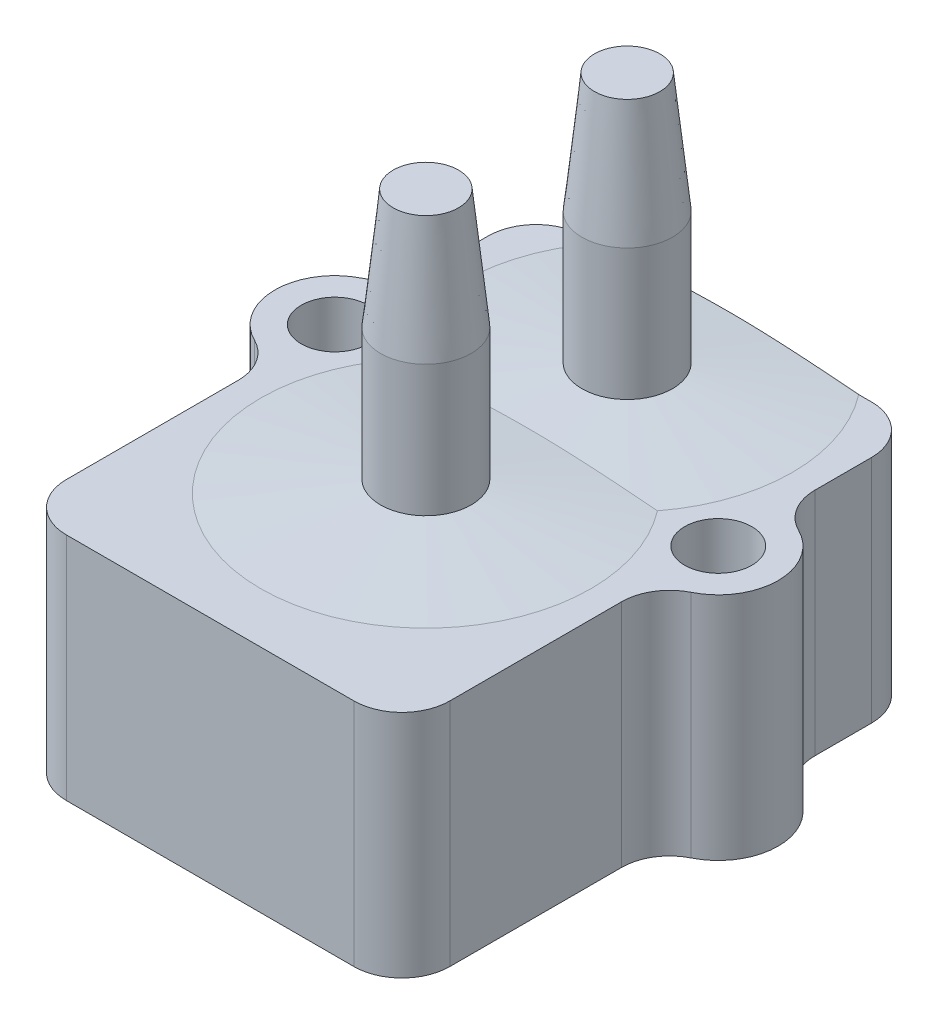
ISO-10303-21;
HEADER;
FILE_DESCRIPTION(('STEP AP214'),'2;1');
FILE_NAME('part.step','',(''),(''),'','','');
FILE_SCHEMA(('AUTOMOTIVE_DESIGN { 1 0 10303 214 1 1 1 1 }'));
ENDSEC;
DATA;
#1=APPLICATION_CONTEXT('core data for automotive mechanical design processes');
#2=APPLICATION_PROTOCOL_DEFINITION('international standard','automotive_design',2000,#1);
#3=PRODUCT_CONTEXT('',#1,'mechanical');
#4=PRODUCT('Part','Part','',(#3));
#5=PRODUCT_RELATED_PRODUCT_CATEGORY('part','',(#4));
#6=PRODUCT_DEFINITION_FORMATION('','',#4);
#7=PRODUCT_DEFINITION_CONTEXT('part definition',#1,'design');
#8=PRODUCT_DEFINITION('design','',#6,#7);
#9=PRODUCT_DEFINITION_SHAPE('','',#8);
#10=(LENGTH_UNIT() NAMED_UNIT(*) SI_UNIT(.MILLI.,.METRE.));
#11=(NAMED_UNIT(*) PLANE_ANGLE_UNIT() SI_UNIT($,.RADIAN.));
#12=(NAMED_UNIT(*) SI_UNIT($,.STERADIAN.) SOLID_ANGLE_UNIT());
#13=UNCERTAINTY_MEASURE_WITH_UNIT(LENGTH_MEASURE(1.E-05),#10,'distance_accuracy_value','');
#14=(GEOMETRIC_REPRESENTATION_CONTEXT(3) GLOBAL_UNCERTAINTY_ASSIGNED_CONTEXT((#13)) GLOBAL_UNIT_ASSIGNED_CONTEXT((#10,
#11,#12)) REPRESENTATION_CONTEXT('',''));
#15=CARTESIAN_POINT('',(0.,0.,0.));
#16=DIRECTION('',(0.,0.,1.));
#17=DIRECTION('',(1.,0.,0.));
#18=AXIS2_PLACEMENT_3D('',#15,#16,#17);
#19=CARTESIAN_POINT('',(-10.16,6.096,-3.048));
#20=DIRECTION('',(0.,1.,0.));
#21=DIRECTION('',(0.,0.,1.));
#22=AXIS2_PLACEMENT_3D('',#19,#20,#21);
#23=PLANE('',#22);
#24=CARTESIAN_POINT('',(-10.16,6.096,-3.048));
#25=DIRECTION('',(0.,1.,0.));
#26=DIRECTION('',(0.,0.,1.));
#27=AXIS2_PLACEMENT_3D('',#24,#25,#26);
#28=CIRCLE('',#27,1.778);
#29=CARTESIAN_POINT('',(-10.16,6.096,-4.826));
#30=VERTEX_POINT('',#29);
#31=EDGE_CURVE('E395',#30,#30,#28,.T.);
#32=ORIENTED_EDGE('',*,*,#31,.F.);
#33=EDGE_LOOP('',(#32));
#34=FACE_BOUND('',#33,.T.);
#35=CARTESIAN_POINT('',(0.,6.096,2.28599999999999));
#36=DIRECTION('',(0.,1.,0.));
#37=DIRECTION('',(0.,0.,1.));
#38=AXIS2_PLACEMENT_3D('',#35,#36,#37);
#39=CIRCLE('',#38,8.75030000000001);
#40=CARTESIAN_POINT('',(6.93658374778251,6.096,-3.048));
#41=VERTEX_POINT('',#40);
#42=CARTESIAN_POINT('',(-6.93658374778248,6.096,-3.048));
#43=VERTEX_POINT('',#42);
#44=EDGE_CURVE('E281',#41,#43,#39,.F.);
#45=ORIENTED_EDGE('',*,*,#44,.T.);
#46=CARTESIAN_POINT('',(0.,6.096,-8.382));
#47=DIRECTION('',(0.,1.,0.));
#48=DIRECTION('',(0.,0.,1.));
#49=AXIS2_PLACEMENT_3D('',#46,#47,#48);
#50=CIRCLE('',#49,8.75030000000002);
#51=CARTESIAN_POINT('',(-6.93658374778248,6.096,-13.716));
#52=VERTEX_POINT('',#51);
#53=EDGE_CURVE('E283',#43,#52,#50,.F.);
#54=ORIENTED_EDGE('',*,*,#53,.T.);
#55=DIRECTION('',(-1.,0.,0.));
#56=VECTOR('',#55,1.);
#57=CARTESIAN_POINT('',(-10.16,6.096,-13.716));
#58=LINE('',#57,#56);
#59=CARTESIAN_POINT('',(-7.61999999999999,6.096,-13.716));
#60=VERTEX_POINT('',#59);
#61=EDGE_CURVE('E376',#52,#60,#58,.T.);
#62=ORIENTED_EDGE('',*,*,#61,.T.);
#63=CARTESIAN_POINT('',(-7.61999999999999,6.096,-11.176));
#64=DIRECTION('',(0.,1.,0.));
#65=DIRECTION('',(0.,0.,1.));
#66=AXIS2_PLACEMENT_3D('',#63,#64,#65);
#67=CIRCLE('',#66,2.54);
#68=CARTESIAN_POINT('',(-10.16,6.096,-11.176));
#69=VERTEX_POINT('',#68);
#70=EDGE_CURVE('E241',#60,#69,#67,.T.);
#71=ORIENTED_EDGE('',*,*,#70,.T.);
#72=DIRECTION('',(0.,0.,1.));
#73=VECTOR('',#72,1.);
#74=CARTESIAN_POINT('',(-10.16,6.096,-6.223));
#75=LINE('',#74,#73);
#76=CARTESIAN_POINT('',(-10.16,6.096,-8.16753367016958));
#77=VERTEX_POINT('',#76);
#78=EDGE_CURVE('E375',#69,#77,#75,.T.);
#79=ORIENTED_EDGE('',*,*,#78,.T.);
#80=CARTESIAN_POINT('',(-12.7,6.096,-8.16753367016958));
#81=DIRECTION('',(0.,1.,0.));
#82=DIRECTION('',(0.,0.,1.));
#83=AXIS2_PLACEMENT_3D('',#80,#81,#82);
#84=CIRCLE('',#83,2.54);
#85=CARTESIAN_POINT('',(-11.5711111111111,6.096,-5.89218537231644));
#86=VERTEX_POINT('',#85);
#87=EDGE_CURVE('E174',#77,#86,#84,.F.);
#88=ORIENTED_EDGE('',*,*,#87,.T.);
#89=CARTESIAN_POINT('',(-10.16,6.096,-3.048));
#90=DIRECTION('',(0.,1.,0.));
#91=DIRECTION('',(0.,0.,1.));
#92=AXIS2_PLACEMENT_3D('',#89,#90,#91);
#93=CIRCLE('',#92,3.175);
#94=CARTESIAN_POINT('',(-11.5711111111111,6.096,-0.203814627683572));
#95=VERTEX_POINT('',#94);
#96=EDGE_CURVE('E184',#86,#95,#93,.T.);
#97=ORIENTED_EDGE('',*,*,#96,.T.);
#98=CARTESIAN_POINT('',(-12.7,6.096,2.07153367016957));
#99=DIRECTION('',(0.,1.,0.));
#100=DIRECTION('',(0.,0.,1.));
#101=AXIS2_PLACEMENT_3D('',#98,#99,#100);
#102=CIRCLE('',#101,2.54);
#103=CARTESIAN_POINT('',(-10.16,6.096,2.07153367016957));
#104=VERTEX_POINT('',#103);
#105=EDGE_CURVE('E264',#95,#104,#102,.F.);
#106=ORIENTED_EDGE('',*,*,#105,.T.);
#107=DIRECTION('',(0.,0.,1.));
#108=VECTOR('',#107,1.);
#109=CARTESIAN_POINT('',(-10.16,6.096,13.716));
#110=LINE('',#109,#108);
#111=CARTESIAN_POINT('',(-10.16,6.096,11.176));
#112=VERTEX_POINT('',#111);
#113=EDGE_CURVE('E379',#104,#112,#110,.T.);
#114=ORIENTED_EDGE('',*,*,#113,.T.);
#115=CARTESIAN_POINT('',(-7.61999999999999,6.096,11.176));
#116=DIRECTION('',(0.,1.,0.));
#117=DIRECTION('',(0.,0.,1.));
#118=AXIS2_PLACEMENT_3D('',#115,#116,#117);
#119=CIRCLE('',#118,2.54);
#120=CARTESIAN_POINT('',(-7.61999999999999,6.096,13.716));
#121=VERTEX_POINT('',#120);
#122=EDGE_CURVE('E235',#112,#121,#119,.T.);
#123=ORIENTED_EDGE('',*,*,#122,.T.);
#124=DIRECTION('',(1.,0.,0.));
#125=VECTOR('',#124,1.);
#126=CARTESIAN_POINT('',(-10.16,6.096,13.716));
#127=LINE('',#126,#125);
#128=CARTESIAN_POINT('',(7.62000000000002,6.096,13.716));
#129=VERTEX_POINT('',#128);
#130=EDGE_CURVE('E386',#121,#129,#127,.T.);
#131=ORIENTED_EDGE('',*,*,#130,.T.);
#132=CARTESIAN_POINT('',(7.62000000000002,6.096,11.176));
#133=DIRECTION('',(0.,1.,0.));
#134=DIRECTION('',(0.,0.,1.));
#135=AXIS2_PLACEMENT_3D('',#132,#133,#134);
#136=CIRCLE('',#135,2.54);
#137=CARTESIAN_POINT('',(10.16,6.096,11.176));
#138=VERTEX_POINT('',#137);
#139=EDGE_CURVE('E237',#129,#138,#136,.T.);
#140=ORIENTED_EDGE('',*,*,#139,.T.);
#141=DIRECTION('',(0.,0.,-1.));
#142=VECTOR('',#141,1.);
#143=CARTESIAN_POINT('',(10.16,6.096,13.716));
#144=LINE('',#143,#142);
#145=CARTESIAN_POINT('',(10.16,6.096,2.07153367016957));
#146=VERTEX_POINT('',#145);
#147=EDGE_CURVE('E389',#138,#146,#144,.T.);
#148=ORIENTED_EDGE('',*,*,#147,.T.);
#149=CARTESIAN_POINT('',(12.7,6.096,2.07153367016957));
#150=DIRECTION('',(0.,1.,0.));
#151=DIRECTION('',(0.,0.,1.));
#152=AXIS2_PLACEMENT_3D('',#149,#150,#151);
#153=CIRCLE('',#152,2.54);
#154=CARTESIAN_POINT('',(11.5711111111111,6.096,-0.203814627683572));
#155=VERTEX_POINT('',#154);
#156=EDGE_CURVE('E272',#146,#155,#153,.F.);
#157=ORIENTED_EDGE('',*,*,#156,.T.);
#158=CARTESIAN_POINT('',(10.16,6.096,-3.048));
#159=DIRECTION('',(0.,1.,0.));
#160=DIRECTION('',(0.,0.,-1.));
#161=AXIS2_PLACEMENT_3D('',#158,#159,#160);
#162=CIRCLE('',#161,3.175);
#163=CARTESIAN_POINT('',(11.5711111111111,6.096,-5.89218537231644));
#164=VERTEX_POINT('',#163);
#165=EDGE_CURVE('E211',#155,#164,#162,.T.);
#166=ORIENTED_EDGE('',*,*,#165,.T.);
#167=CARTESIAN_POINT('',(12.7,6.096,-8.16753367016958));
#168=DIRECTION('',(0.,1.,0.));
#169=DIRECTION('',(0.,0.,1.));
#170=AXIS2_PLACEMENT_3D('',#167,#168,#169);
#171=CIRCLE('',#170,2.54);
#172=CARTESIAN_POINT('',(10.16,6.096,-8.16753367016958));
#173=VERTEX_POINT('',#172);
#174=EDGE_CURVE('E268',#164,#173,#171,.F.);
#175=ORIENTED_EDGE('',*,*,#174,.T.);
#176=DIRECTION('',(0.,0.,-1.));
#177=VECTOR('',#176,1.);
#178=CARTESIAN_POINT('',(10.16,6.096,-6.223));
#179=LINE('',#178,#177);
#180=CARTESIAN_POINT('',(10.16,6.096,-11.176));
#181=VERTEX_POINT('',#180);
#182=EDGE_CURVE('E210',#173,#181,#179,.T.);
#183=ORIENTED_EDGE('',*,*,#182,.T.);
#184=CARTESIAN_POINT('',(7.62000000000001,6.096,-11.176));
#185=DIRECTION('',(0.,1.,0.));
#186=DIRECTION('',(0.,0.,1.));
#187=AXIS2_PLACEMENT_3D('',#184,#185,#186);
#188=CIRCLE('',#187,2.54);
#189=CARTESIAN_POINT('',(7.62000000000001,6.096,-13.716));
#190=VERTEX_POINT('',#189);
#191=EDGE_CURVE('E239',#181,#190,#188,.T.);
#192=ORIENTED_EDGE('',*,*,#191,.T.);
#193=CARTESIAN_POINT('',(6.93658374778251,6.096,-13.716));
#194=VERTEX_POINT('',#193);
#195=EDGE_CURVE('E377',#190,#194,#58,.T.);
#196=ORIENTED_EDGE('',*,*,#195,.T.);
#197=CARTESIAN_POINT('',(0.,6.096,-8.382));
#198=DIRECTION('',(0.,1.,0.));
#199=DIRECTION('',(0.,0.,1.));
#200=AXIS2_PLACEMENT_3D('',#197,#198,#199);
#201=CIRCLE('',#200,8.75030000000002);
#202=EDGE_CURVE('E60',#194,#41,#201,.F.);
#203=ORIENTED_EDGE('',*,*,#202,.T.);
#204=EDGE_LOOP('',(#45,#54,#62,#71,#79,#88,#97,#106,#114,#123,#131,#140,#148,#157,#166,#175,
#183,#192,#196,#203));
#205=FACE_BOUND('',#204,.T.);
#206=CARTESIAN_POINT('',(10.16,6.096,-3.048));
#207=DIRECTION('',(0.,1.,0.));
#208=DIRECTION('',(0.,0.,-1.));
#209=AXIS2_PLACEMENT_3D('',#206,#207,#208);
#210=CIRCLE('',#209,1.778);
#211=CARTESIAN_POINT('',(10.16,6.096,-4.826));
#212=VERTEX_POINT('',#211);
#213=EDGE_CURVE('E404',#212,#212,#210,.T.);
#214=ORIENTED_EDGE('',*,*,#213,.F.);
#215=EDGE_LOOP('',(#214));
#216=FACE_BOUND('',#215,.T.);
#217=ADVANCED_FACE('F33',(#34,#205,#216),#23,.T.);
#218=CARTESIAN_POINT('',(-10.16,-6.096,-3.048));
#219=DIRECTION('',(0.,1.,0.));
#220=DIRECTION('',(0.,0.,1.));
#221=AXIS2_PLACEMENT_3D('',#218,#219,#220);
#222=PLANE('',#221);
#223=CARTESIAN_POINT('',(-10.16,-6.096,-3.048));
#224=DIRECTION('',(0.,1.,0.));
#225=DIRECTION('',(0.,0.,1.));
#226=AXIS2_PLACEMENT_3D('',#223,#224,#225);
#227=CIRCLE('',#226,1.778);
#228=CARTESIAN_POINT('',(-10.16,-6.096,-4.826));
#229=VERTEX_POINT('',#228);
#230=EDGE_CURVE('E400',#229,#229,#227,.T.);
#231=ORIENTED_EDGE('',*,*,#230,.T.);
#232=EDGE_LOOP('',(#231));
#233=FACE_BOUND('',#232,.T.);
#234=DIRECTION('',(0.,0.,1.));
#235=VECTOR('',#234,1.);
#236=CARTESIAN_POINT('',(-10.16,-6.096,-6.223));
#237=LINE('',#236,#235);
#238=CARTESIAN_POINT('',(-10.16,-6.096,-11.176));
#239=VERTEX_POINT('',#238);
#240=CARTESIAN_POINT('',(-10.16,-6.096,-8.16753367016958));
#241=VERTEX_POINT('',#240);
#242=EDGE_CURVE('E193',#239,#241,#237,.T.);
#243=ORIENTED_EDGE('',*,*,#242,.F.);
#244=CARTESIAN_POINT('',(-7.61999999999999,-6.096,-11.176));
#245=DIRECTION('',(0.,1.,0.));
#246=DIRECTION('',(0.,0.,1.));
#247=AXIS2_PLACEMENT_3D('',#244,#245,#246);
#248=CIRCLE('',#247,2.54);
#249=CARTESIAN_POINT('',(-7.61999999999999,-6.096,-13.716));
#250=VERTEX_POINT('',#249);
#251=EDGE_CURVE('E227',#239,#250,#248,.F.);
#252=ORIENTED_EDGE('',*,*,#251,.T.);
#253=DIRECTION('',(-1.,0.,0.));
#254=VECTOR('',#253,1.);
#255=CARTESIAN_POINT('',(-10.16,-6.096,-13.716));
#256=LINE('',#255,#254);
#257=CARTESIAN_POINT('',(7.62000000000001,-6.096,-13.716));
#258=VERTEX_POINT('',#257);
#259=EDGE_CURVE('E198',#258,#250,#256,.T.);
#260=ORIENTED_EDGE('',*,*,#259,.F.);
#261=CARTESIAN_POINT('',(7.62000000000001,-6.096,-11.176));
#262=DIRECTION('',(0.,1.,0.));
#263=DIRECTION('',(0.,0.,1.));
#264=AXIS2_PLACEMENT_3D('',#261,#262,#263);
#265=CIRCLE('',#264,2.54);
#266=CARTESIAN_POINT('',(10.16,-6.096,-11.176));
#267=VERTEX_POINT('',#266);
#268=EDGE_CURVE('E225',#258,#267,#265,.F.);
#269=ORIENTED_EDGE('',*,*,#268,.T.);
#270=DIRECTION('',(0.,0.,-1.));
#271=VECTOR('',#270,1.);
#272=CARTESIAN_POINT('',(10.16,-6.096,-6.223));
#273=LINE('',#272,#271);
#274=CARTESIAN_POINT('',(10.16,-6.096,-8.16753367016958));
#275=VERTEX_POINT('',#274);
#276=EDGE_CURVE('E372',#275,#267,#273,.T.);
#277=ORIENTED_EDGE('',*,*,#276,.F.);
#278=CARTESIAN_POINT('',(12.7,-6.096,-8.16753367016958));
#279=DIRECTION('',(0.,1.,0.));
#280=DIRECTION('',(0.,0.,1.));
#281=AXIS2_PLACEMENT_3D('',#278,#279,#280);
#282=CIRCLE('',#281,2.54);
#283=CARTESIAN_POINT('',(11.5711111111111,-6.096,-5.89218537231644));
#284=VERTEX_POINT('',#283);
#285=EDGE_CURVE('E266',#275,#284,#282,.T.);
#286=ORIENTED_EDGE('',*,*,#285,.T.);
#287=CARTESIAN_POINT('',(10.16,-6.096,-3.048));
#288=DIRECTION('',(0.,1.,0.));
#289=DIRECTION('',(0.,0.,-1.));
#290=AXIS2_PLACEMENT_3D('',#287,#288,#289);
#291=CIRCLE('',#290,3.175);
#292=CARTESIAN_POINT('',(11.5711111111111,-6.096,-0.203814627683572));
#293=VERTEX_POINT('',#292);
#294=EDGE_CURVE('E207',#293,#284,#291,.T.);
#295=ORIENTED_EDGE('',*,*,#294,.F.);
#296=CARTESIAN_POINT('',(12.7,-6.096,2.07153367016957));
#297=DIRECTION('',(0.,1.,0.));
#298=DIRECTION('',(0.,0.,1.));
#299=AXIS2_PLACEMENT_3D('',#296,#297,#298);
#300=CIRCLE('',#299,2.54);
#301=CARTESIAN_POINT('',(10.16,-6.096,2.07153367016957));
#302=VERTEX_POINT('',#301);
#303=EDGE_CURVE('E270',#293,#302,#300,.T.);
#304=ORIENTED_EDGE('',*,*,#303,.T.);
#305=DIRECTION('',(0.,0.,-1.));
#306=VECTOR('',#305,1.);
#307=CARTESIAN_POINT('',(10.16,-6.096,13.716));
#308=LINE('',#307,#306);
#309=CARTESIAN_POINT('',(10.16,-6.096,11.176));
#310=VERTEX_POINT('',#309);
#311=EDGE_CURVE('E204',#310,#302,#308,.T.);
#312=ORIENTED_EDGE('',*,*,#311,.F.);
#313=CARTESIAN_POINT('',(7.62000000000002,-6.096,11.176));
#314=DIRECTION('',(0.,1.,0.));
#315=DIRECTION('',(0.,0.,1.));
#316=AXIS2_PLACEMENT_3D('',#313,#314,#315);
#317=CIRCLE('',#316,2.54);
#318=CARTESIAN_POINT('',(7.62000000000002,-6.096,13.716));
#319=VERTEX_POINT('',#318);
#320=EDGE_CURVE('E223',#310,#319,#317,.F.);
#321=ORIENTED_EDGE('',*,*,#320,.T.);
#322=DIRECTION('',(1.,0.,0.));
#323=VECTOR('',#322,1.);
#324=CARTESIAN_POINT('',(-10.16,-6.096,13.716));
#325=LINE('',#324,#323);
#326=CARTESIAN_POINT('',(-7.61999999999999,-6.096,13.716));
#327=VERTEX_POINT('',#326);
#328=EDGE_CURVE('E196',#327,#319,#325,.T.);
#329=ORIENTED_EDGE('',*,*,#328,.F.);
#330=CARTESIAN_POINT('',(-7.61999999999999,-6.096,11.176));
#331=DIRECTION('',(0.,1.,0.));
#332=DIRECTION('',(0.,0.,1.));
#333=AXIS2_PLACEMENT_3D('',#330,#331,#332);
#334=CIRCLE('',#333,2.54);
#335=CARTESIAN_POINT('',(-10.16,-6.096,11.176));
#336=VERTEX_POINT('',#335);
#337=EDGE_CURVE('E221',#327,#336,#334,.F.);
#338=ORIENTED_EDGE('',*,*,#337,.T.);
#339=DIRECTION('',(0.,0.,1.));
#340=VECTOR('',#339,1.);
#341=CARTESIAN_POINT('',(-10.16,-6.096,13.716));
#342=LINE('',#341,#340);
#343=CARTESIAN_POINT('',(-10.16,-6.096,2.07153367016957));
#344=VERTEX_POINT('',#343);
#345=EDGE_CURVE('E192',#344,#336,#342,.T.);
#346=ORIENTED_EDGE('',*,*,#345,.F.);
#347=CARTESIAN_POINT('',(-12.7,-6.096,2.07153367016957));
#348=DIRECTION('',(0.,1.,0.));
#349=DIRECTION('',(0.,0.,1.));
#350=AXIS2_PLACEMENT_3D('',#347,#348,#349);
#351=CIRCLE('',#350,2.54);
#352=CARTESIAN_POINT('',(-11.5711111111111,-6.096,-0.203814627683572));
#353=VERTEX_POINT('',#352);
#354=EDGE_CURVE('E191',#344,#353,#351,.T.);
#355=ORIENTED_EDGE('',*,*,#354,.T.);
#356=CARTESIAN_POINT('',(-10.16,-6.096,-3.048));
#357=DIRECTION('',(0.,1.,0.));
#358=DIRECTION('',(0.,0.,1.));
#359=AXIS2_PLACEMENT_3D('',#356,#357,#358);
#360=CIRCLE('',#359,3.175);
#361=CARTESIAN_POINT('',(-11.5711111111111,-6.096,-5.89218537231644));
#362=VERTEX_POINT('',#361);
#363=EDGE_CURVE('E181',#362,#353,#360,.T.);
#364=ORIENTED_EDGE('',*,*,#363,.F.);
#365=CARTESIAN_POINT('',(-12.7,-6.096,-8.16753367016958));
#366=DIRECTION('',(0.,1.,0.));
#367=DIRECTION('',(0.,0.,1.));
#368=AXIS2_PLACEMENT_3D('',#365,#366,#367);
#369=CIRCLE('',#368,2.54);
#370=EDGE_CURVE('E164',#362,#241,#369,.T.);
#371=ORIENTED_EDGE('',*,*,#370,.T.);
#372=EDGE_LOOP('',(#243,#252,#260,#269,#277,#286,#295,#304,#312,#321,#329,#338,#346,#355,#364,#371));
#373=FACE_BOUND('',#372,.T.);
#374=CARTESIAN_POINT('',(10.16,-6.096,-3.048));
#375=DIRECTION('',(0.,1.,0.));
#376=DIRECTION('',(0.,0.,-1.));
#377=AXIS2_PLACEMENT_3D('',#374,#375,#376);
#378=CIRCLE('',#377,1.778);
#379=CARTESIAN_POINT('',(10.16,-6.096,-4.826));
#380=VERTEX_POINT('',#379);
#381=EDGE_CURVE('E407',#380,#380,#378,.T.);
#382=ORIENTED_EDGE('',*,*,#381,.T.);
#383=EDGE_LOOP('',(#382));
#384=FACE_BOUND('',#383,.T.);
#385=ADVANCED_FACE('F188',(#233,#373,#384),#222,.F.);
#386=CARTESIAN_POINT('',(10.16,6.096,-6.223));
#387=DIRECTION('',(-1.,0.,0.));
#388=DIRECTION('',(0.,0.,1.));
#389=AXIS2_PLACEMENT_3D('',#386,#387,#388);
#390=PLANE('',#389);
#391=ORIENTED_EDGE('',*,*,#276,.T.);
#392=DIRECTION('',(0.,-1.,0.));
#393=VECTOR('',#392,1.);
#394=CARTESIAN_POINT('',(10.16,6.096,-11.176));
#395=LINE('',#394,#393);
#396=EDGE_CURVE('E246',#267,#181,#395,.F.);
#397=ORIENTED_EDGE('',*,*,#396,.T.);
#398=ORIENTED_EDGE('',*,*,#182,.F.);
#399=DIRECTION('',(0.,1.,0.));
#400=VECTOR('',#399,1.);
#401=CARTESIAN_POINT('',(10.16,-6.096,-8.16753367016958));
#402=LINE('',#401,#400);
#403=EDGE_CURVE('E243',#173,#275,#402,.F.);
#404=ORIENTED_EDGE('',*,*,#403,.T.);
#405=EDGE_LOOP('',(#391,#397,#398,#404));
#406=FACE_BOUND('',#405,.T.);
#407=ADVANCED_FACE('F329',(#406),#390,.F.);
#408=CARTESIAN_POINT('',(-10.16,6.096,-13.716));
#409=DIRECTION('',(0.,0.,1.));
#410=DIRECTION('',(1.,0.,0.));
#411=AXIS2_PLACEMENT_3D('',#408,#409,#410);
#412=PLANE('',#411);
#413=ORIENTED_EDGE('',*,*,#259,.T.);
#414=DIRECTION('',(0.,-1.,0.));
#415=VECTOR('',#414,1.);
#416=CARTESIAN_POINT('',(-7.61999999999999,6.096,-13.716));
#417=LINE('',#416,#415);
#418=EDGE_CURVE('E232',#250,#60,#417,.F.);
#419=ORIENTED_EDGE('',*,*,#418,.T.);
#420=ORIENTED_EDGE('',*,*,#61,.F.);
#421=CARTESIAN_POINT('',(-6.93658374778248,6.096,-13.716));
#422=CARTESIAN_POINT('',(-6.57122053330194,6.12639803815599,-13.716));
#423=CARTESIAN_POINT('',(-6.20578492503149,6.15599204832168,-13.716));
#424=CARTESIAN_POINT('',(-5.4746986408897,6.2127540273888,-13.716));
#425=CARTESIAN_POINT('',(-5.1090479509265,6.2399218139073,-13.716));
#426=CARTESIAN_POINT('',(-4.37726837644171,6.29102584712248,-13.716));
#427=CARTESIAN_POINT('',(-4.01113933577509,6.3149598927732,-13.716));
#428=CARTESIAN_POINT('',(-3.27861865055262,6.35839761109693,-13.716));
#429=CARTESIAN_POINT('',(-2.91222700982513,6.37790134709105,-13.716));
#430=CARTESIAN_POINT('',(-2.18034559012538,6.41102877108636,-13.716));
#431=CARTESIAN_POINT('',(-1.81485667846361,6.42467108117558,-13.716));
#432=CARTESIAN_POINT('',(-1.08368125362434,6.44481387207168,-13.716));
#433=CARTESIAN_POINT('',(-0.717994744279316,6.45131448674755,-13.716));
#434=CARTESIAN_POINT('',(0.0133094726627878,6.45637714258104,-13.716));
#435=CARTESIAN_POINT('',(0.378927160646714,6.45494191414575,-13.716));
#436=CARTESIAN_POINT('',(1.11005012039509,6.4443244354885,-13.716));
#437=CARTESIAN_POINT('',(1.47555539103187,6.43514210993655,-13.716));
#438=CARTESIAN_POINT('',(2.05337528608097,6.41533451931989,-13.716));
#439=CARTESIAN_POINT('',(2.26577016910731,6.40692221074932,-13.716));
#440=CARTESIAN_POINT('',(2.69046877759324,6.38811330833082,-13.716));
#441=CARTESIAN_POINT('',(2.90277250436311,6.37771674403161,-13.716));
#442=CARTESIAN_POINT('',(3.53961653501211,6.3439661226508,-13.716));
#443=CARTESIAN_POINT('',(3.96402088347552,6.31805367601204,-13.716));
#444=CARTESIAN_POINT('',(4.81333309101415,6.26134154144627,-13.716));
#445=CARTESIAN_POINT('',(5.23824029628231,6.23053233173898,-13.716));
#446=CARTESIAN_POINT('',(5.87533832765377,6.18178468444923,-13.716));
#447=CARTESIAN_POINT('',(6.08762766344336,6.1651159426365,-13.716));
#448=CARTESIAN_POINT('',(6.51214743402887,6.13106252180698,-13.716));
#449=CARTESIAN_POINT('',(6.72437786923954,6.11367784796698,-13.716));
#450=CARTESIAN_POINT('',(6.93658374778251,6.096,-13.716));
#451=B_SPLINE_CURVE_WITH_KNOTS('',3,(#421,#422,#423,#424,#425,#426,#427,#428,#429,#430,#431,
#432,#433,#434,#435,#436,#437,#438,#439,#440,#441,#442,#443,#444,#445,#446,#447,#448,#449,#450),
.UNSPECIFIED.,.F.,.F.,(4,2,2,2,2,2,2,2,2,2,2,2,2,2,4),(0.,1.09988418033371,2.19985097116358,
3.30056272279228,4.40125874127998,5.49843145141379,6.59558359501488,7.69235827581851,
8.78914362138991,9.42681940178628,10.064485686921,11.3400247869635,12.6180752272308,
13.2569024772013,13.8957251087165),.UNSPECIFIED.);
#452=EDGE_CURVE('E11',#52,#194,#451,.T.);
#453=ORIENTED_EDGE('',*,*,#452,.T.);
#454=ORIENTED_EDGE('',*,*,#195,.F.);
#455=DIRECTION('',(0.,-1.,0.));
#456=VECTOR('',#455,1.);
#457=CARTESIAN_POINT('',(7.62000000000001,6.096,-13.716));
#458=LINE('',#457,#456);
#459=EDGE_CURVE('E229',#190,#258,#458,.T.);
#460=ORIENTED_EDGE('',*,*,#459,.T.);
#461=EDGE_LOOP('',(#413,#419,#420,#453,#454,#460));
#462=FACE_BOUND('',#461,.T.);
#463=ADVANCED_FACE('F299',(#462),#412,.F.);
#464=CARTESIAN_POINT('',(-10.16,6.096,-6.223));
#465=DIRECTION('',(1.,0.,0.));
#466=DIRECTION('',(0.,0.,-1.));
#467=AXIS2_PLACEMENT_3D('',#464,#465,#466);
#468=PLANE('',#467);
#469=ORIENTED_EDGE('',*,*,#242,.T.);
#470=DIRECTION('',(0.,1.,0.));
#471=VECTOR('',#470,1.);
#472=CARTESIAN_POINT('',(-10.16,6.096,-8.16753367016958));
#473=LINE('',#472,#471);
#474=EDGE_CURVE('E169',#241,#77,#473,.T.);
#475=ORIENTED_EDGE('',*,*,#474,.T.);
#476=ORIENTED_EDGE('',*,*,#78,.F.);
#477=DIRECTION('',(0.,-1.,0.));
#478=VECTOR('',#477,1.);
#479=CARTESIAN_POINT('',(-10.16,6.096,-11.176));
#480=LINE('',#479,#478);
#481=EDGE_CURVE('E185',#69,#239,#480,.T.);
#482=ORIENTED_EDGE('',*,*,#481,.T.);
#483=EDGE_LOOP('',(#469,#475,#476,#482));
#484=FACE_BOUND('',#483,.T.);
#485=ADVANCED_FACE('F354',(#484),#468,.F.);
#486=CARTESIAN_POINT('',(-10.16,6.096,-3.048));
#487=DIRECTION('',(0.,-1.,0.));
#488=DIRECTION('',(0.,0.,-1.));
#489=AXIS2_PLACEMENT_3D('',#486,#487,#488);
#490=CYLINDRICAL_SURFACE('',#489,3.175);
#491=ORIENTED_EDGE('',*,*,#96,.F.);
#492=DIRECTION('',(0.,-1.,0.));
#493=VECTOR('',#492,1.);
#494=CARTESIAN_POINT('',(-11.5711111111111,6.096,-5.89218537231644));
#495=LINE('',#494,#493);
#496=EDGE_CURVE('E168',#86,#362,#495,.T.);
#497=ORIENTED_EDGE('',*,*,#496,.T.);
#498=ORIENTED_EDGE('',*,*,#363,.T.);
#499=DIRECTION('',(0.,-1.,0.));
#500=VECTOR('',#499,1.);
#501=CARTESIAN_POINT('',(-11.5711111111111,6.096,-0.203814627683572));
#502=LINE('',#501,#500);
#503=EDGE_CURVE('E186',#353,#95,#502,.F.);
#504=ORIENTED_EDGE('',*,*,#503,.T.);
#505=EDGE_LOOP('',(#491,#497,#498,#504));
#506=FACE_BOUND('',#505,.T.);
#507=ADVANCED_FACE('F180',(#506),#490,.T.);
#508=CARTESIAN_POINT('',(-10.16,6.096,13.716));
#509=DIRECTION('',(1.,0.,0.));
#510=DIRECTION('',(0.,0.,-1.));
#511=AXIS2_PLACEMENT_3D('',#508,#509,#510);
#512=PLANE('',#511);
#513=ORIENTED_EDGE('',*,*,#113,.F.);
#514=DIRECTION('',(0.,1.,0.));
#515=VECTOR('',#514,1.);
#516=CARTESIAN_POINT('',(-10.16,-6.096,2.07153367016957));
#517=LINE('',#516,#515);
#518=EDGE_CURVE('E218',#104,#344,#517,.F.);
#519=ORIENTED_EDGE('',*,*,#518,.T.);
#520=ORIENTED_EDGE('',*,*,#345,.T.);
#521=DIRECTION('',(0.,-1.,0.));
#522=VECTOR('',#521,1.);
#523=CARTESIAN_POINT('',(-10.16,6.096,11.176));
#524=LINE('',#523,#522);
#525=EDGE_CURVE('E216',#336,#112,#524,.F.);
#526=ORIENTED_EDGE('',*,*,#525,.T.);
#527=EDGE_LOOP('',(#513,#519,#520,#526));
#528=FACE_BOUND('',#527,.T.);
#529=ADVANCED_FACE('F348',(#528),#512,.F.);
#530=CARTESIAN_POINT('',(-10.16,6.096,13.716));
#531=DIRECTION('',(0.,0.,-1.));
#532=DIRECTION('',(-1.,0.,0.));
#533=AXIS2_PLACEMENT_3D('',#530,#531,#532);
#534=PLANE('',#533);
#535=ORIENTED_EDGE('',*,*,#328,.T.);
#536=DIRECTION('',(0.,-1.,0.));
#537=VECTOR('',#536,1.);
#538=CARTESIAN_POINT('',(7.62000000000002,6.096,13.716));
#539=LINE('',#538,#537);
#540=EDGE_CURVE('E175',#319,#129,#539,.F.);
#541=ORIENTED_EDGE('',*,*,#540,.T.);
#542=ORIENTED_EDGE('',*,*,#130,.F.);
#543=DIRECTION('',(0.,-1.,0.));
#544=VECTOR('',#543,1.);
#545=CARTESIAN_POINT('',(-7.61999999999999,6.096,13.716));
#546=LINE('',#545,#544);
#547=EDGE_CURVE('E258',#121,#327,#546,.T.);
#548=ORIENTED_EDGE('',*,*,#547,.T.);
#549=EDGE_LOOP('',(#535,#541,#542,#548));
#550=FACE_BOUND('',#549,.T.);
#551=ADVANCED_FACE('F344',(#550),#534,.F.);
#552=CARTESIAN_POINT('',(10.16,6.096,13.716));
#553=DIRECTION('',(-1.,0.,0.));
#554=DIRECTION('',(0.,0.,1.));
#555=AXIS2_PLACEMENT_3D('',#552,#553,#554);
#556=PLANE('',#555);
#557=ORIENTED_EDGE('',*,*,#311,.T.);
#558=DIRECTION('',(0.,1.,0.));
#559=VECTOR('',#558,1.);
#560=CARTESIAN_POINT('',(10.16,6.096,2.07153367016957));
#561=LINE('',#560,#559);
#562=EDGE_CURVE('E256',#302,#146,#561,.T.);
#563=ORIENTED_EDGE('',*,*,#562,.T.);
#564=ORIENTED_EDGE('',*,*,#147,.F.);
#565=DIRECTION('',(0.,-1.,0.));
#566=VECTOR('',#565,1.);
#567=CARTESIAN_POINT('',(10.16,6.096,11.176));
#568=LINE('',#567,#566);
#569=EDGE_CURVE('E253',#138,#310,#568,.T.);
#570=ORIENTED_EDGE('',*,*,#569,.T.);
#571=EDGE_LOOP('',(#557,#563,#564,#570));
#572=FACE_BOUND('',#571,.T.);
#573=ADVANCED_FACE('F340',(#572),#556,.F.);
#574=CARTESIAN_POINT('',(10.16,6.096,-3.048));
#575=DIRECTION('',(0.,-1.,0.));
#576=DIRECTION('',(0.,0.,-1.));
#577=AXIS2_PLACEMENT_3D('',#574,#575,#576);
#578=CYLINDRICAL_SURFACE('',#577,3.175);
#579=ORIENTED_EDGE('',*,*,#294,.T.);
#580=DIRECTION('',(0.,-1.,0.));
#581=VECTOR('',#580,1.);
#582=CARTESIAN_POINT('',(11.5711111111111,6.096,-5.89218537231644));
#583=LINE('',#582,#581);
#584=EDGE_CURVE('E251',#284,#164,#583,.F.);
#585=ORIENTED_EDGE('',*,*,#584,.T.);
#586=ORIENTED_EDGE('',*,*,#165,.F.);
#587=DIRECTION('',(0.,-1.,0.));
#588=VECTOR('',#587,1.);
#589=CARTESIAN_POINT('',(11.5711111111111,6.096,-0.203814627683572));
#590=LINE('',#589,#588);
#591=EDGE_CURVE('E248',#155,#293,#590,.T.);
#592=ORIENTED_EDGE('',*,*,#591,.T.);
#593=EDGE_LOOP('',(#579,#585,#586,#592));
#594=FACE_BOUND('',#593,.T.);
#595=ADVANCED_FACE('F337',(#594),#578,.T.);
#596=CARTESIAN_POINT('',(-10.16,6.096,-3.048));
#597=DIRECTION('',(0.,-1.,0.));
#598=DIRECTION('',(0.,0.,-1.));
#599=AXIS2_PLACEMENT_3D('',#596,#597,#598);
#600=CYLINDRICAL_SURFACE('',#599,1.778);
#601=CARTESIAN_POINT('',(-10.16,6.096,-4.826));
#602=CARTESIAN_POINT('',(-10.16,5.969,-4.826));
#603=CARTESIAN_POINT('',(-10.16,5.842,-4.826));
#604=CARTESIAN_POINT('',(-10.16,5.588,-4.826));
#605=CARTESIAN_POINT('',(-10.16,5.461,-4.826));
#606=CARTESIAN_POINT('',(-10.16,5.207,-4.826));
#607=CARTESIAN_POINT('',(-10.16,5.08,-4.826));
#608=CARTESIAN_POINT('',(-10.16,4.826,-4.826));
#609=CARTESIAN_POINT('',(-10.16,4.699,-4.826));
#610=CARTESIAN_POINT('',(-10.16,4.445,-4.826));
#611=CARTESIAN_POINT('',(-10.16,4.318,-4.826));
#612=CARTESIAN_POINT('',(-10.16,4.064,-4.826));
#613=CARTESIAN_POINT('',(-10.16,3.937,-4.826));
#614=CARTESIAN_POINT('',(-10.16,3.683,-4.826));
#615=CARTESIAN_POINT('',(-10.16,3.556,-4.826));
#616=CARTESIAN_POINT('',(-10.16,3.302,-4.826));
#617=CARTESIAN_POINT('',(-10.16,3.175,-4.826));
#618=CARTESIAN_POINT('',(-10.16,2.921,-4.826));
#619=CARTESIAN_POINT('',(-10.16,2.794,-4.826));
#620=CARTESIAN_POINT('',(-10.16,2.54,-4.826));
#621=CARTESIAN_POINT('',(-10.16,2.413,-4.826));
#622=CARTESIAN_POINT('',(-10.16,2.159,-4.826));
#623=CARTESIAN_POINT('',(-10.16,2.032,-4.826));
#624=CARTESIAN_POINT('',(-10.16,1.778,-4.826));
#625=CARTESIAN_POINT('',(-10.16,1.651,-4.826));
#626=CARTESIAN_POINT('',(-10.16,1.397,-4.826));
#627=CARTESIAN_POINT('',(-10.16,1.27,-4.826));
#628=CARTESIAN_POINT('',(-10.16,1.016,-4.826));
#629=CARTESIAN_POINT('',(-10.16,0.888999999999999,-4.826));
#630=CARTESIAN_POINT('',(-10.16,0.635,-4.826));
#631=CARTESIAN_POINT('',(-10.16,0.507999999999999,-4.826));
#632=CARTESIAN_POINT('',(-10.16,0.253999999999999,-4.826));
#633=CARTESIAN_POINT('',(-10.16,0.126999999999999,-4.826));
#634=CARTESIAN_POINT('',(-10.16,-0.127000000000001,-4.826));
#635=CARTESIAN_POINT('',(-10.16,-0.254000000000001,-4.826));
#636=CARTESIAN_POINT('',(-10.16,-0.508000000000001,-4.826));
#637=CARTESIAN_POINT('',(-10.16,-0.635000000000001,-4.826));
#638=CARTESIAN_POINT('',(-10.16,-0.889000000000001,-4.826));
#639=CARTESIAN_POINT('',(-10.16,-1.016,-4.826));
#640=CARTESIAN_POINT('',(-10.16,-1.27,-4.826));
#641=CARTESIAN_POINT('',(-10.16,-1.397,-4.826));
#642=CARTESIAN_POINT('',(-10.16,-1.651,-4.826));
#643=CARTESIAN_POINT('',(-10.16,-1.778,-4.826));
#644=CARTESIAN_POINT('',(-10.16,-2.032,-4.826));
#645=CARTESIAN_POINT('',(-10.16,-2.159,-4.826));
#646=CARTESIAN_POINT('',(-10.16,-2.413,-4.826));
#647=CARTESIAN_POINT('',(-10.16,-2.54,-4.826));
#648=CARTESIAN_POINT('',(-10.16,-2.794,-4.826));
#649=CARTESIAN_POINT('',(-10.16,-2.921,-4.826));
#650=CARTESIAN_POINT('',(-10.16,-3.175,-4.826));
#651=CARTESIAN_POINT('',(-10.16,-3.302,-4.826));
#652=CARTESIAN_POINT('',(-10.16,-3.556,-4.826));
#653=CARTESIAN_POINT('',(-10.16,-3.683,-4.826));
#654=CARTESIAN_POINT('',(-10.16,-3.937,-4.826));
#655=CARTESIAN_POINT('',(-10.16,-4.064,-4.826));
#656=CARTESIAN_POINT('',(-10.16,-4.318,-4.826));
#657=CARTESIAN_POINT('',(-10.16,-4.445,-4.826));
#658=CARTESIAN_POINT('',(-10.16,-4.699,-4.826));
#659=CARTESIAN_POINT('',(-10.16,-4.826,-4.826));
#660=CARTESIAN_POINT('',(-10.16,-5.08,-4.826));
#661=CARTESIAN_POINT('',(-10.16,-5.207,-4.826));
#662=CARTESIAN_POINT('',(-10.16,-5.461,-4.826));
#663=CARTESIAN_POINT('',(-10.16,-5.588,-4.826));
#664=CARTESIAN_POINT('',(-10.16,-5.842,-4.826));
#665=CARTESIAN_POINT('',(-10.16,-5.969,-4.826));
#666=CARTESIAN_POINT('',(-10.16,-6.096,-4.826));
#667=B_SPLINE_CURVE_WITH_KNOTS('',3,(#601,#602,#603,#604,#605,#606,#607,#608,#609,#610,#611,
#612,#613,#614,#615,#616,#617,#618,#619,#620,#621,#622,#623,#624,#625,#626,#627,#628,#629,#630,
#631,#632,#633,#634,#635,#636,#637,#638,#639,#640,#641,#642,#643,#644,#645,#646,#647,#648,#649,
#650,#651,#652,#653,#654,#655,#656,#657,#658,#659,#660,#661,#662,#663,#664,#665,#666),
.UNSPECIFIED.,.F.,.F.,(4,2,2,2,2,2,2,2,2,2,2,2,2,2,2,2,2,2,2,2,2,2,2,2,2,2,2,2,2,2,2,2,4),(0.,
0.380999999999999,0.762,1.143,1.524,1.905,2.286,2.667,3.048,3.429,3.81,4.191,4.572,4.953,5.334,
5.715,6.096,6.477,6.858,7.239,7.62,8.001,8.382,8.763,9.144,9.525,9.906,10.287,10.668,11.049,
11.43,11.811,12.192),.UNSPECIFIED.);
#668=EDGE_CURVE('BSEAM334',#30,#229,#667,.T.);
#669=ORIENTED_EDGE('',*,*,#31,.T.);
#670=ORIENTED_EDGE('',*,*,#230,.F.);
#671=ORIENTED_EDGE('',*,*,#668,.T.);
#672=ORIENTED_EDGE('',*,*,#668,.F.);
#673=EDGE_LOOP('',(#669,#671,#670,#672));
#674=FACE_BOUND('',#673,.T.);
#675=ADVANCED_FACE('F334',(#674),#600,.F.);
#676=CARTESIAN_POINT('',(10.16,6.096,-3.048));
#677=DIRECTION('',(0.,-1.,0.));
#678=DIRECTION('',(0.,0.,-1.));
#679=AXIS2_PLACEMENT_3D('',#676,#677,#678);
#680=CYLINDRICAL_SURFACE('',#679,1.778);
#681=CARTESIAN_POINT('',(10.16,6.096,-4.826));
#682=CARTESIAN_POINT('',(10.16,5.969,-4.826));
#683=CARTESIAN_POINT('',(10.16,5.842,-4.826));
#684=CARTESIAN_POINT('',(10.16,5.588,-4.826));
#685=CARTESIAN_POINT('',(10.16,5.461,-4.826));
#686=CARTESIAN_POINT('',(10.16,5.207,-4.826));
#687=CARTESIAN_POINT('',(10.16,5.08,-4.826));
#688=CARTESIAN_POINT('',(10.16,4.826,-4.826));
#689=CARTESIAN_POINT('',(10.16,4.699,-4.826));
#690=CARTESIAN_POINT('',(10.16,4.445,-4.826));
#691=CARTESIAN_POINT('',(10.16,4.318,-4.826));
#692=CARTESIAN_POINT('',(10.16,4.064,-4.826));
#693=CARTESIAN_POINT('',(10.16,3.937,-4.826));
#694=CARTESIAN_POINT('',(10.16,3.683,-4.826));
#695=CARTESIAN_POINT('',(10.16,3.556,-4.826));
#696=CARTESIAN_POINT('',(10.16,3.302,-4.826));
#697=CARTESIAN_POINT('',(10.16,3.175,-4.826));
#698=CARTESIAN_POINT('',(10.16,2.921,-4.826));
#699=CARTESIAN_POINT('',(10.16,2.794,-4.826));
#700=CARTESIAN_POINT('',(10.16,2.54,-4.826));
#701=CARTESIAN_POINT('',(10.16,2.413,-4.826));
#702=CARTESIAN_POINT('',(10.16,2.159,-4.826));
#703=CARTESIAN_POINT('',(10.16,2.032,-4.826));
#704=CARTESIAN_POINT('',(10.16,1.778,-4.826));
#705=CARTESIAN_POINT('',(10.16,1.651,-4.826));
#706=CARTESIAN_POINT('',(10.16,1.397,-4.826));
#707=CARTESIAN_POINT('',(10.16,1.27,-4.826));
#708=CARTESIAN_POINT('',(10.16,1.016,-4.826));
#709=CARTESIAN_POINT('',(10.16,0.888999999999999,-4.826));
#710=CARTESIAN_POINT('',(10.16,0.635,-4.826));
#711=CARTESIAN_POINT('',(10.16,0.507999999999999,-4.826));
#712=CARTESIAN_POINT('',(10.16,0.253999999999999,-4.826));
#713=CARTESIAN_POINT('',(10.16,0.126999999999999,-4.826));
#714=CARTESIAN_POINT('',(10.16,-0.127000000000001,-4.826));
#715=CARTESIAN_POINT('',(10.16,-0.254000000000001,-4.826));
#716=CARTESIAN_POINT('',(10.16,-0.508000000000001,-4.826));
#717=CARTESIAN_POINT('',(10.16,-0.635000000000001,-4.826));
#718=CARTESIAN_POINT('',(10.16,-0.889000000000001,-4.826));
#719=CARTESIAN_POINT('',(10.16,-1.016,-4.826));
#720=CARTESIAN_POINT('',(10.16,-1.27,-4.826));
#721=CARTESIAN_POINT('',(10.16,-1.397,-4.826));
#722=CARTESIAN_POINT('',(10.16,-1.651,-4.826));
#723=CARTESIAN_POINT('',(10.16,-1.778,-4.826));
#724=CARTESIAN_POINT('',(10.16,-2.032,-4.826));
#725=CARTESIAN_POINT('',(10.16,-2.159,-4.826));
#726=CARTESIAN_POINT('',(10.16,-2.413,-4.826));
#727=CARTESIAN_POINT('',(10.16,-2.54,-4.826));
#728=CARTESIAN_POINT('',(10.16,-2.794,-4.826));
#729=CARTESIAN_POINT('',(10.16,-2.921,-4.826));
#730=CARTESIAN_POINT('',(10.16,-3.175,-4.826));
#731=CARTESIAN_POINT('',(10.16,-3.302,-4.826));
#732=CARTESIAN_POINT('',(10.16,-3.556,-4.826));
#733=CARTESIAN_POINT('',(10.16,-3.683,-4.826));
#734=CARTESIAN_POINT('',(10.16,-3.937,-4.826));
#735=CARTESIAN_POINT('',(10.16,-4.064,-4.826));
#736=CARTESIAN_POINT('',(10.16,-4.318,-4.826));
#737=CARTESIAN_POINT('',(10.16,-4.445,-4.826));
#738=CARTESIAN_POINT('',(10.16,-4.699,-4.826));
#739=CARTESIAN_POINT('',(10.16,-4.826,-4.826));
#740=CARTESIAN_POINT('',(10.16,-5.08,-4.826));
#741=CARTESIAN_POINT('',(10.16,-5.207,-4.826));
#742=CARTESIAN_POINT('',(10.16,-5.461,-4.826));
#743=CARTESIAN_POINT('',(10.16,-5.588,-4.826));
#744=CARTESIAN_POINT('',(10.16,-5.842,-4.826));
#745=CARTESIAN_POINT('',(10.16,-5.969,-4.826));
#746=CARTESIAN_POINT('',(10.16,-6.096,-4.826));
#747=B_SPLINE_CURVE_WITH_KNOTS('',3,(#681,#682,#683,#684,#685,#686,#687,#688,#689,#690,#691,
#692,#693,#694,#695,#696,#697,#698,#699,#700,#701,#702,#703,#704,#705,#706,#707,#708,#709,#710,
#711,#712,#713,#714,#715,#716,#717,#718,#719,#720,#721,#722,#723,#724,#725,#726,#727,#728,#729,
#730,#731,#732,#733,#734,#735,#736,#737,#738,#739,#740,#741,#742,#743,#744,#745,#746),
.UNSPECIFIED.,.F.,.F.,(4,2,2,2,2,2,2,2,2,2,2,2,2,2,2,2,2,2,2,2,2,2,2,2,2,2,2,2,2,2,2,2,4),(0.,
0.380999999999999,0.762,1.143,1.524,1.905,2.286,2.667,3.048,3.429,3.81,4.191,4.572,4.953,5.334,
5.715,6.096,6.477,6.858,7.239,7.62,8.001,8.382,8.763,9.144,9.525,9.906,10.287,10.668,11.049,
11.43,11.811,12.192),.UNSPECIFIED.);
#748=EDGE_CURVE('BSEAM429',#212,#380,#747,.T.);
#749=ORIENTED_EDGE('',*,*,#213,.T.);
#750=ORIENTED_EDGE('',*,*,#381,.F.);
#751=ORIENTED_EDGE('',*,*,#748,.T.);
#752=ORIENTED_EDGE('',*,*,#748,.F.);
#753=EDGE_LOOP('',(#749,#751,#750,#752));
#754=FACE_BOUND('',#753,.T.);
#755=ADVANCED_FACE('F429',(#754),#680,.F.);
#756=CARTESIAN_POINT('',(-12.7,6.096,-8.16753367016958));
#757=DIRECTION('',(0.,-1.,0.));
#758=DIRECTION('',(0.,0.,-1.));
#759=AXIS2_PLACEMENT_3D('',#756,#757,#758);
#760=CYLINDRICAL_SURFACE('',#759,2.54);
#761=ORIENTED_EDGE('',*,*,#87,.F.);
#762=ORIENTED_EDGE('',*,*,#474,.F.);
#763=ORIENTED_EDGE('',*,*,#370,.F.);
#764=ORIENTED_EDGE('',*,*,#496,.F.);
#765=EDGE_LOOP('',(#761,#762,#763,#764));
#766=FACE_BOUND('',#765,.T.);
#767=ADVANCED_FACE('F167',(#766),#760,.F.);
#768=CARTESIAN_POINT('',(-12.7,6.096,2.07153367016957));
#769=DIRECTION('',(0.,-1.,0.));
#770=DIRECTION('',(0.,0.,-1.));
#771=AXIS2_PLACEMENT_3D('',#768,#769,#770);
#772=CYLINDRICAL_SURFACE('',#771,2.54);
#773=ORIENTED_EDGE('',*,*,#105,.F.);
#774=ORIENTED_EDGE('',*,*,#503,.F.);
#775=ORIENTED_EDGE('',*,*,#354,.F.);
#776=ORIENTED_EDGE('',*,*,#518,.F.);
#777=EDGE_LOOP('',(#773,#774,#775,#776));
#778=FACE_BOUND('',#777,.T.);
#779=ADVANCED_FACE('F428',(#778),#772,.F.);
#780=CARTESIAN_POINT('',(-7.61999999999999,6.096,-11.176));
#781=DIRECTION('',(0.,-1.,0.));
#782=DIRECTION('',(0.,0.,-1.));
#783=AXIS2_PLACEMENT_3D('',#780,#781,#782);
#784=CYLINDRICAL_SURFACE('',#783,2.54);
#785=ORIENTED_EDGE('',*,*,#70,.F.);
#786=ORIENTED_EDGE('',*,*,#418,.F.);
#787=ORIENTED_EDGE('',*,*,#251,.F.);
#788=ORIENTED_EDGE('',*,*,#481,.F.);
#789=EDGE_LOOP('',(#785,#786,#787,#788));
#790=FACE_BOUND('',#789,.T.);
#791=ADVANCED_FACE('F373',(#790),#784,.T.);
#792=CARTESIAN_POINT('',(7.62000000000001,6.096,-11.176));
#793=DIRECTION('',(0.,-1.,0.));
#794=DIRECTION('',(0.,0.,-1.));
#795=AXIS2_PLACEMENT_3D('',#792,#793,#794);
#796=CYLINDRICAL_SURFACE('',#795,2.54);
#797=ORIENTED_EDGE('',*,*,#191,.F.);
#798=ORIENTED_EDGE('',*,*,#396,.F.);
#799=ORIENTED_EDGE('',*,*,#268,.F.);
#800=ORIENTED_EDGE('',*,*,#459,.F.);
#801=EDGE_LOOP('',(#797,#798,#799,#800));
#802=FACE_BOUND('',#801,.T.);
#803=ADVANCED_FACE('F415',(#802),#796,.T.);
#804=CARTESIAN_POINT('',(12.7,6.096,-8.16753367016958));
#805=DIRECTION('',(0.,-1.,0.));
#806=DIRECTION('',(0.,0.,-1.));
#807=AXIS2_PLACEMENT_3D('',#804,#805,#806);
#808=CYLINDRICAL_SURFACE('',#807,2.54);
#809=ORIENTED_EDGE('',*,*,#174,.F.);
#810=ORIENTED_EDGE('',*,*,#584,.F.);
#811=ORIENTED_EDGE('',*,*,#285,.F.);
#812=ORIENTED_EDGE('',*,*,#403,.F.);
#813=EDGE_LOOP('',(#809,#810,#811,#812));
#814=FACE_BOUND('',#813,.T.);
#815=ADVANCED_FACE('F421',(#814),#808,.F.);
#816=CARTESIAN_POINT('',(12.7,6.096,2.07153367016957));
#817=DIRECTION('',(0.,-1.,0.));
#818=DIRECTION('',(0.,0.,-1.));
#819=AXIS2_PLACEMENT_3D('',#816,#817,#818);
#820=CYLINDRICAL_SURFACE('',#819,2.54);
#821=ORIENTED_EDGE('',*,*,#156,.F.);
#822=ORIENTED_EDGE('',*,*,#562,.F.);
#823=ORIENTED_EDGE('',*,*,#303,.F.);
#824=ORIENTED_EDGE('',*,*,#591,.F.);
#825=EDGE_LOOP('',(#821,#822,#823,#824));
#826=FACE_BOUND('',#825,.T.);
#827=ADVANCED_FACE('F439',(#826),#820,.F.);
#828=CARTESIAN_POINT('',(7.62000000000002,6.096,11.176));
#829=DIRECTION('',(0.,-1.,0.));
#830=DIRECTION('',(0.,0.,-1.));
#831=AXIS2_PLACEMENT_3D('',#828,#829,#830);
#832=CYLINDRICAL_SURFACE('',#831,2.54);
#833=ORIENTED_EDGE('',*,*,#139,.F.);
#834=ORIENTED_EDGE('',*,*,#540,.F.);
#835=ORIENTED_EDGE('',*,*,#320,.F.);
#836=ORIENTED_EDGE('',*,*,#569,.F.);
#837=EDGE_LOOP('',(#833,#834,#835,#836));
#838=FACE_BOUND('',#837,.T.);
#839=ADVANCED_FACE('F442',(#838),#832,.T.);
#840=CARTESIAN_POINT('',(-7.61999999999999,6.096,11.176));
#841=DIRECTION('',(0.,-1.,0.));
#842=DIRECTION('',(0.,0.,-1.));
#843=AXIS2_PLACEMENT_3D('',#840,#841,#842);
#844=CYLINDRICAL_SURFACE('',#843,2.54);
#845=ORIENTED_EDGE('',*,*,#122,.F.);
#846=ORIENTED_EDGE('',*,*,#525,.F.);
#847=ORIENTED_EDGE('',*,*,#337,.F.);
#848=ORIENTED_EDGE('',*,*,#547,.F.);
#849=EDGE_LOOP('',(#845,#846,#847,#848));
#850=FACE_BOUND('',#849,.T.);
#851=ADVANCED_FACE('F445',(#850),#844,.T.);
#852=CARTESIAN_POINT('',(0.,20.066,-8.382));
#853=DIRECTION('',(0.,-1.,0.));
#854=DIRECTION('',(0.,0.,-1.));
#855=AXIS2_PLACEMENT_3D('',#852,#853,#854);
#856=CYLINDRICAL_SURFACE('',#855,2.4003);
#857=CARTESIAN_POINT('',(0.,6.76341189393709,-8.382));
#858=DIRECTION('',(0.,1.,0.));
#859=DIRECTION('',(0.,0.,1.));
#860=AXIS2_PLACEMENT_3D('',#857,#858,#859);
#861=CIRCLE('',#860,2.4003);
#862=CARTESIAN_POINT('',(0.,6.76341189393709,-5.9817));
#863=VERTEX_POINT('',#862);
#864=EDGE_CURVE('E291',#863,#863,#861,.T.);
#865=ORIENTED_EDGE('',*,*,#864,.T.);
#866=EDGE_LOOP('',(#865));
#867=FACE_BOUND('',#866,.T.);
#868=CARTESIAN_POINT('',(0.,13.7159999999999,-8.382));
#869=DIRECTION('',(0.,1.,0.));
#870=DIRECTION('',(0.,0.,1.));
#871=AXIS2_PLACEMENT_3D('',#868,#869,#870);
#872=CIRCLE('',#871,2.4003);
#873=CARTESIAN_POINT('',(0.,13.7159999999999,-5.9817));
#874=VERTEX_POINT('',#873);
#875=EDGE_CURVE('E288',#874,#874,#872,.F.);
#876=ORIENTED_EDGE('',*,*,#875,.T.);
#877=EDGE_LOOP('',(#876));
#878=FACE_BOUND('',#877,.T.);
#879=ADVANCED_FACE('F448',(#867,#878),#856,.T.);
#880=CARTESIAN_POINT('',(0.,20.066,-8.382));
#881=DIRECTION('',(0.,1.,0.));
#882=DIRECTION('',(0.,0.,1.));
#883=AXIS2_PLACEMENT_3D('',#880,#881,#882);
#884=PLANE('',#883);
#885=CARTESIAN_POINT('',(0.,20.066,-8.382));
#886=DIRECTION('',(0.,1.,0.));
#887=DIRECTION('',(0.,0.,1.));
#888=AXIS2_PLACEMENT_3D('',#885,#886,#887);
#889=CIRCLE('',#888,1.73288810606296);
#890=CARTESIAN_POINT('',(0.,20.066,-6.64911189393704));
#891=VERTEX_POINT('',#890);
#892=EDGE_CURVE('E47',#891,#891,#889,.T.);
#893=ORIENTED_EDGE('',*,*,#892,.T.);
#894=EDGE_LOOP('',(#893));
#895=FACE_BOUND('',#894,.T.);
#896=ADVANCED_FACE('F453',(#895),#884,.T.);
#897=CARTESIAN_POINT('',(0.,20.066,2.28599999999999));
#898=DIRECTION('',(0.,-1.,0.));
#899=DIRECTION('',(0.,0.,-1.));
#900=AXIS2_PLACEMENT_3D('',#897,#898,#899);
#901=CYLINDRICAL_SURFACE('',#900,2.4003);
#902=CARTESIAN_POINT('',(0.,6.76341189393709,2.28599999999999));
#903=DIRECTION('',(0.,1.,0.));
#904=DIRECTION('',(0.,0.,1.));
#905=AXIS2_PLACEMENT_3D('',#902,#903,#904);
#906=CIRCLE('',#905,2.4003);
#907=CARTESIAN_POINT('',(0.,6.76341189393709,4.68629999999999));
#908=VERTEX_POINT('',#907);
#909=EDGE_CURVE('E277',#908,#908,#906,.T.);
#910=ORIENTED_EDGE('',*,*,#909,.T.);
#911=EDGE_LOOP('',(#910));
#912=FACE_BOUND('',#911,.T.);
#913=CARTESIAN_POINT('',(0.,13.7159999999998,2.28599999999999));
#914=DIRECTION('',(0.,1.,0.));
#915=DIRECTION('',(0.,0.,1.));
#916=AXIS2_PLACEMENT_3D('',#913,#914,#915);
#917=CIRCLE('',#916,2.4003);
#918=CARTESIAN_POINT('',(0.,13.7159999999998,4.68629999999999));
#919=VERTEX_POINT('',#918);
#920=EDGE_CURVE('E274',#919,#919,#917,.F.);
#921=ORIENTED_EDGE('',*,*,#920,.T.);
#922=EDGE_LOOP('',(#921));
#923=FACE_BOUND('',#922,.T.);
#924=ADVANCED_FACE('F474',(#912,#923),#901,.T.);
#925=CARTESIAN_POINT('',(0.,20.066,2.28599999999999));
#926=DIRECTION('',(0.,1.,0.));
#927=DIRECTION('',(0.,0.,1.));
#928=AXIS2_PLACEMENT_3D('',#925,#926,#927);
#929=PLANE('',#928);
#930=CARTESIAN_POINT('',(0.,20.066,2.28599999999999));
#931=DIRECTION('',(0.,1.,0.));
#932=DIRECTION('',(0.,0.,1.));
#933=AXIS2_PLACEMENT_3D('',#930,#931,#932);
#934=CIRCLE('',#933,1.73288810606296);
#935=CARTESIAN_POINT('',(0.,20.066,4.01888810606295));
#936=VERTEX_POINT('',#935);
#937=EDGE_CURVE('E285',#936,#936,#934,.T.);
#938=ORIENTED_EDGE('',*,*,#937,.T.);
#939=EDGE_LOOP('',(#938));
#940=FACE_BOUND('',#939,.T.);
#941=ADVANCED_FACE('F308',(#940),#929,.T.);
#942=CARTESIAN_POINT('',(0.,6.76341189393709,-8.382));
#943=DIRECTION('',(0.,-1.,0.));
#944=DIRECTION('',(0.,0.,-1.));
#945=AXIS2_PLACEMENT_3D('',#942,#943,#944);
#946=CONICAL_SURFACE('',#945,2.4003,1.46607657167523);
#947=ORIENTED_EDGE('',*,*,#864,.F.);
#948=EDGE_LOOP('',(#947));
#949=FACE_BOUND('',#948,.T.);
#950=CARTESIAN_POINT('',(-6.93898401268073,6.0958,-3.048));
#951=CARTESIAN_POINT('',(-6.57354171483672,6.12620852455263,-3.048));
#952=CARTESIAN_POINT('',(-6.20802703544791,6.15581324701385,-3.048));
#953=CARTESIAN_POINT('',(-5.47678261768966,6.21259706434799,-3.048));
#954=CARTESIAN_POINT('',(-5.11105286523579,6.23977597696515,-3.048));
#955=CARTESIAN_POINT('',(-4.37911481398026,6.29090266567955,-3.04800000000001));
#956=CARTESIAN_POINT('',(-4.0129063588444,6.31484823855181,-3.048));
#957=CARTESIAN_POINT('',(-3.28022675732259,6.35830909333667,-3.048));
#958=CARTESIAN_POINT('',(-2.913755614759,6.37782443845141,-3.048));
#959=CARTESIAN_POINT('',(-2.18171572708087,6.41097439735578,-3.048));
#960=CARTESIAN_POINT('',(-1.81614785009403,6.42462764214637,-3.048));
#961=CARTESIAN_POINT('',(-1.08481429399241,6.44479047832233,-3.048));
#962=CARTESIAN_POINT('',(-0.719048618720157,6.4513002038228,-3.048));
#963=CARTESIAN_POINT('',(0.0124139695792253,6.45637790227347,-3.048));
#964=CARTESIAN_POINT('',(0.378110862912581,6.45494860922413,-3.048));
#965=CARTESIAN_POINT('',(1.10939229088395,6.44433914760529,-3.048));
#966=CARTESIAN_POINT('',(1.47497682439372,6.43515890359562,-3.048));
#967=CARTESIAN_POINT('',(2.05299682542678,6.41534926553287,-3.048));
#968=CARTESIAN_POINT('',(2.26551254661046,6.40693319328588,-3.048));
#969=CARTESIAN_POINT('',(2.69045272967077,6.38811444484626,-3.048));
#970=CARTESIAN_POINT('',(2.90287719285918,6.37771179823728,-3.048));
#971=CARTESIAN_POINT('',(3.54008343136422,6.34394016802143,-3.048));
#972=CARTESIAN_POINT('',(3.96472909583976,6.31801003826767,-3.048));
#973=CARTESIAN_POINT('',(4.81452466161787,6.26125830542267,-3.048));
#974=CARTESIAN_POINT('',(5.23967390799093,6.23042716566035,-3.048));
#975=CARTESIAN_POINT('',(5.87713470781788,6.18164497287815,-3.048));
#976=CARTESIAN_POINT('',(6.08954484926192,6.16496444698015,-3.048));
#977=CARTESIAN_POINT('',(6.5143061881867,6.13088704693418,-3.048));
#978=CARTESIAN_POINT('',(6.72665738608284,6.1134901779708,-3.048));
#979=CARTESIAN_POINT('',(6.93898401268076,6.0958,-3.048));
#980=B_SPLINE_CURVE_WITH_KNOTS('',3,(#950,#951,#952,#953,#954,#955,#956,#957,#958,#959,#960,
#961,#962,#963,#964,#965,#966,#967,#968,#969,#970,#971,#972,#973,#974,#975,#976,#977,#978,#979),
.UNSPECIFIED.,.F.,.F.,(4,2,2,2,2,2,2,2,2,2,2,2,2,2,4),(0.,1.10012321958107,2.20032902408006,
3.30128077508234,4.4022168187915,5.49962747663939,6.59701753093842,7.6940296948424,
8.79105253611213,9.42909097657743,10.0671199162474,11.3433847876189,12.6221641941468,
13.2613555158256,13.9005422121236),.UNSPECIFIED.);
#981=EDGE_CURVE('E37',#41,#43,#980,.F.);
#982=ORIENTED_EDGE('',*,*,#981,.F.);
#983=ORIENTED_EDGE('',*,*,#202,.F.);
#984=ORIENTED_EDGE('',*,*,#452,.F.);
#985=ORIENTED_EDGE('',*,*,#53,.F.);
#986=EDGE_LOOP('',(#982,#983,#984,#985));
#987=FACE_BOUND('',#986,.T.);
#988=ADVANCED_FACE('F303',(#949,#987),#946,.T.);
#989=CARTESIAN_POINT('',(0.,6.76341189393709,2.28599999999999));
#990=DIRECTION('',(0.,-1.,0.));
#991=DIRECTION('',(0.,0.,-1.));
#992=AXIS2_PLACEMENT_3D('',#989,#990,#991);
#993=CONICAL_SURFACE('',#992,2.4003,1.46607657167523);
#994=ORIENTED_EDGE('',*,*,#44,.F.);
#995=ORIENTED_EDGE('',*,*,#981,.T.);
#996=EDGE_LOOP('',(#994,#995));
#997=FACE_BOUND('',#996,.T.);
#998=ORIENTED_EDGE('',*,*,#909,.F.);
#999=EDGE_LOOP('',(#998));
#1000=FACE_BOUND('',#999,.T.);
#1001=ADVANCED_FACE('F307',(#997,#1000),#993,.T.);
#1002=CARTESIAN_POINT('',(0.,20.066,2.28599999999999));
#1003=DIRECTION('',(0.,-1.,0.));
#1004=DIRECTION('',(0.,0.,-1.));
#1005=AXIS2_PLACEMENT_3D('',#1002,#1003,#1004);
#1006=CONICAL_SURFACE('',#1005,1.73288810606296,0.104719755119656);
#1007=ORIENTED_EDGE('',*,*,#920,.F.);
#1008=EDGE_LOOP('',(#1007));
#1009=FACE_BOUND('',#1008,.T.);
#1010=ORIENTED_EDGE('',*,*,#937,.F.);
#1011=EDGE_LOOP('',(#1010));
#1012=FACE_BOUND('',#1011,.T.);
#1013=ADVANCED_FACE('F314',(#1009,#1012),#1006,.T.);
#1014=CARTESIAN_POINT('',(0.,20.066,-8.382));
#1015=DIRECTION('',(0.,-1.,0.));
#1016=DIRECTION('',(0.,0.,-1.));
#1017=AXIS2_PLACEMENT_3D('',#1014,#1015,#1016);
#1018=CONICAL_SURFACE('',#1017,1.73288810606296,0.104719755119657);
#1019=ORIENTED_EDGE('',*,*,#875,.F.);
#1020=EDGE_LOOP('',(#1019));
#1021=FACE_BOUND('',#1020,.T.);
#1022=ORIENTED_EDGE('',*,*,#892,.F.);
#1023=EDGE_LOOP('',(#1022));
#1024=FACE_BOUND('',#1023,.T.);
#1025=ADVANCED_FACE('F35',(#1021,#1024),#1018,.T.);
#1026=CLOSED_SHELL('',(#217,#385,#407,#463,#485,#507,#529,#551,#573,#595,#675,#755,#767,#779,
#791,#803,#815,#827,#839,#851,#879,#896,#924,#941,#988,#1001,#1013,#1025));
#1027=MANIFOLD_SOLID_BREP('B2',#1026);
#1028=ADVANCED_BREP_SHAPE_REPRESENTATION('',(#18,#1027),#14);
#1029=SHAPE_DEFINITION_REPRESENTATION(#9,#1028);
ENDSEC;
END-ISO-10303-21;
